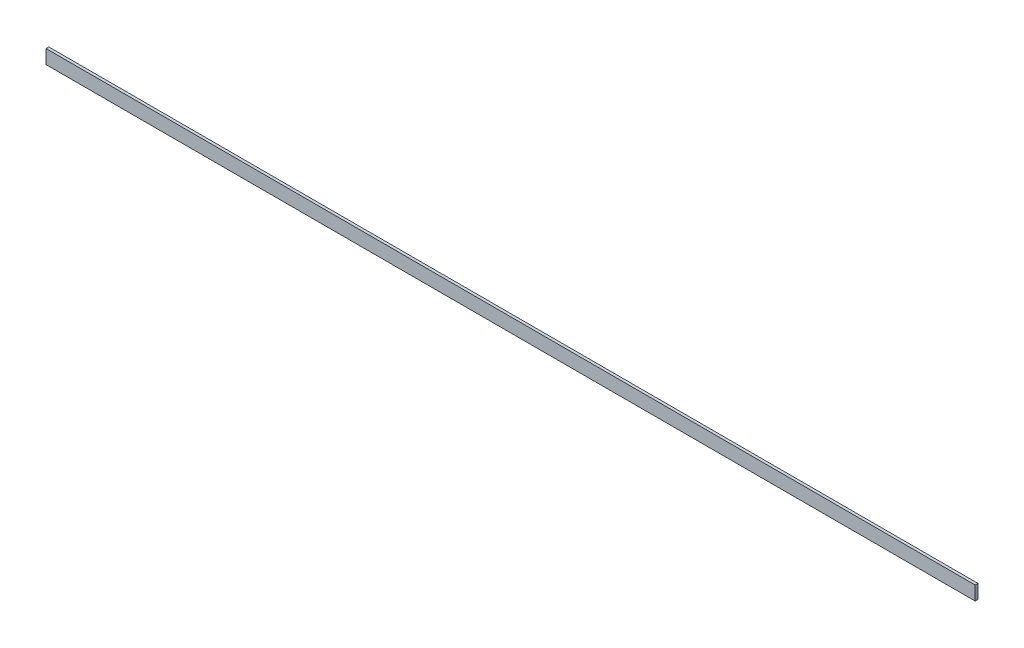
ISO-10303-21;
HEADER;
FILE_DESCRIPTION(('STEP AP214'),'2;1');
FILE_NAME('part.step','',(''),(''),'','','');
FILE_SCHEMA(('AUTOMOTIVE_DESIGN { 1 0 10303 214 1 1 1 1 }'));
ENDSEC;
DATA;
#1=APPLICATION_CONTEXT('core data for automotive mechanical design processes');
#2=APPLICATION_PROTOCOL_DEFINITION('international standard','automotive_design',2000,#1);
#3=PRODUCT_CONTEXT('',#1,'mechanical');
#4=PRODUCT('Part','Part','',(#3));
#5=PRODUCT_RELATED_PRODUCT_CATEGORY('part','',(#4));
#6=PRODUCT_DEFINITION_FORMATION('','',#4);
#7=PRODUCT_DEFINITION_CONTEXT('part definition',#1,'design');
#8=PRODUCT_DEFINITION('design','',#6,#7);
#9=PRODUCT_DEFINITION_SHAPE('','',#8);
#10=(LENGTH_UNIT() NAMED_UNIT(*) SI_UNIT(.MILLI.,.METRE.));
#11=(NAMED_UNIT(*) PLANE_ANGLE_UNIT() SI_UNIT($,.RADIAN.));
#12=(NAMED_UNIT(*) SI_UNIT($,.STERADIAN.) SOLID_ANGLE_UNIT());
#13=UNCERTAINTY_MEASURE_WITH_UNIT(LENGTH_MEASURE(1.E-05),#10,'distance_accuracy_value','');
#14=(GEOMETRIC_REPRESENTATION_CONTEXT(3) GLOBAL_UNCERTAINTY_ASSIGNED_CONTEXT((#13)) GLOBAL_UNIT_ASSIGNED_CONTEXT((#10,
#11,#12)) REPRESENTATION_CONTEXT('',''));
#15=CARTESIAN_POINT('',(0.,0.,0.));
#16=DIRECTION('',(0.,0.,1.));
#17=DIRECTION('',(1.,0.,0.));
#18=AXIS2_PLACEMENT_3D('',#15,#16,#17);
#19=CARTESIAN_POINT('',(1000.,15.0000000000001,3.));
#20=DIRECTION('',(1.,0.,0.));
#21=DIRECTION('',(0.,0.,-1.));
#22=AXIS2_PLACEMENT_3D('',#19,#20,#21);
#23=PLANE('',#22);
#24=DIRECTION('',(0.,-1.,0.));
#25=VECTOR('',#24,1.);
#26=CARTESIAN_POINT('',(1000.,15.0000000000001,0.));
#27=LINE('',#26,#25);
#28=CARTESIAN_POINT('',(1000.,15.0000000000001,0.));
#29=VERTEX_POINT('',#28);
#30=CARTESIAN_POINT('',(1000.,1.21430643318376E-13,0.));
#31=VERTEX_POINT('',#30);
#32=EDGE_CURVE('E114',#29,#31,#27,.T.);
#33=ORIENTED_EDGE('',*,*,#32,.F.);
#34=DIRECTION('',(0.,0.,-1.));
#35=VECTOR('',#34,1.);
#36=CARTESIAN_POINT('',(1000.,15.0000000000001,3.));
#37=LINE('',#36,#35);
#38=CARTESIAN_POINT('',(1000.,15.0000000000001,3.));
#39=VERTEX_POINT('',#38);
#40=EDGE_CURVE('E11',#39,#29,#37,.T.);
#41=ORIENTED_EDGE('',*,*,#40,.F.);
#42=DIRECTION('',(0.,-1.,0.));
#43=VECTOR('',#42,1.);
#44=CARTESIAN_POINT('',(1000.,15.0000000000001,3.));
#45=LINE('',#44,#43);
#46=CARTESIAN_POINT('',(1000.,1.21430643318376E-13,3.));
#47=VERTEX_POINT('',#46);
#48=EDGE_CURVE('E107',#39,#47,#45,.T.);
#49=ORIENTED_EDGE('',*,*,#48,.T.);
#50=DIRECTION('',(0.,0.,-1.));
#51=VECTOR('',#50,1.);
#52=CARTESIAN_POINT('',(1000.,1.21430643318376E-13,3.));
#53=LINE('',#52,#51);
#54=EDGE_CURVE('E46',#47,#31,#53,.T.);
#55=ORIENTED_EDGE('',*,*,#54,.T.);
#56=EDGE_LOOP('',(#33,#41,#49,#55));
#57=FACE_BOUND('',#56,.T.);
#58=ADVANCED_FACE('F43',(#57),#23,.T.);
#59=CARTESIAN_POINT('',(1000.,15.0000000000001,3.));
#60=DIRECTION('',(0.,-1.,0.));
#61=DIRECTION('',(1.,0.,0.));
#62=AXIS2_PLACEMENT_3D('',#59,#60,#61);
#63=PLANE('',#62);
#64=DIRECTION('',(-1.,0.,0.));
#65=VECTOR('',#64,1.);
#66=CARTESIAN_POINT('',(1000.,15.0000000000001,0.));
#67=LINE('',#66,#65);
#68=CARTESIAN_POINT('',(0.,15.,0.));
#69=VERTEX_POINT('',#68);
#70=EDGE_CURVE('E77',#29,#69,#67,.T.);
#71=ORIENTED_EDGE('',*,*,#70,.T.);
#72=DIRECTION('',(0.,0.,-1.));
#73=VECTOR('',#72,1.);
#74=CARTESIAN_POINT('',(0.,15.,3.));
#75=LINE('',#74,#73);
#76=CARTESIAN_POINT('',(0.,15.,3.));
#77=VERTEX_POINT('',#76);
#78=EDGE_CURVE('E53',#77,#69,#75,.T.);
#79=ORIENTED_EDGE('',*,*,#78,.F.);
#80=DIRECTION('',(-1.,0.,0.));
#81=VECTOR('',#80,1.);
#82=CARTESIAN_POINT('',(1000.,15.0000000000001,3.));
#83=LINE('',#82,#81);
#84=EDGE_CURVE('E92',#39,#77,#83,.T.);
#85=ORIENTED_EDGE('',*,*,#84,.F.);
#86=ORIENTED_EDGE('',*,*,#40,.T.);
#87=EDGE_LOOP('',(#71,#79,#85,#86));
#88=FACE_BOUND('',#87,.T.);
#89=ADVANCED_FACE('F130',(#88),#63,.F.);
#90=CARTESIAN_POINT('',(0.,15.,3.));
#91=DIRECTION('',(1.,0.,0.));
#92=DIRECTION('',(0.,1.,0.));
#93=AXIS2_PLACEMENT_3D('',#90,#91,#92);
#94=PLANE('',#93);
#95=DIRECTION('',(0.,-1.,0.));
#96=VECTOR('',#95,1.);
#97=CARTESIAN_POINT('',(0.,15.,0.));
#98=LINE('',#97,#96);
#99=CARTESIAN_POINT('',(0.,0.,0.));
#100=VERTEX_POINT('',#99);
#101=EDGE_CURVE('E100',#69,#100,#98,.T.);
#102=ORIENTED_EDGE('',*,*,#101,.T.);
#103=DIRECTION('',(0.,0.,-1.));
#104=VECTOR('',#103,1.);
#105=CARTESIAN_POINT('',(0.,0.,3.));
#106=LINE('',#105,#104);
#107=CARTESIAN_POINT('',(0.,0.,3.));
#108=VERTEX_POINT('',#107);
#109=EDGE_CURVE('E97',#108,#100,#106,.T.);
#110=ORIENTED_EDGE('',*,*,#109,.F.);
#111=DIRECTION('',(0.,-1.,0.));
#112=VECTOR('',#111,1.);
#113=CARTESIAN_POINT('',(0.,15.,3.));
#114=LINE('',#113,#112);
#115=EDGE_CURVE('E89',#77,#108,#114,.T.);
#116=ORIENTED_EDGE('',*,*,#115,.F.);
#117=ORIENTED_EDGE('',*,*,#78,.T.);
#118=EDGE_LOOP('',(#102,#110,#116,#117));
#119=FACE_BOUND('',#118,.T.);
#120=ADVANCED_FACE('F98',(#119),#94,.F.);
#121=CARTESIAN_POINT('',(0.,0.,3.));
#122=DIRECTION('',(0.,1.,0.));
#123=DIRECTION('',(-1.,0.,0.));
#124=AXIS2_PLACEMENT_3D('',#121,#122,#123);
#125=PLANE('',#124);
#126=DIRECTION('',(1.,0.,0.));
#127=VECTOR('',#126,1.);
#128=CARTESIAN_POINT('',(0.,0.,0.));
#129=LINE('',#128,#127);
#130=EDGE_CURVE('E118',#100,#31,#129,.T.);
#131=ORIENTED_EDGE('',*,*,#130,.T.);
#132=ORIENTED_EDGE('',*,*,#54,.F.);
#133=DIRECTION('',(1.,0.,0.));
#134=VECTOR('',#133,1.);
#135=CARTESIAN_POINT('',(0.,0.,3.));
#136=LINE('',#135,#134);
#137=EDGE_CURVE('E86',#108,#47,#136,.T.);
#138=ORIENTED_EDGE('',*,*,#137,.F.);
#139=ORIENTED_EDGE('',*,*,#109,.T.);
#140=EDGE_LOOP('',(#131,#132,#138,#139));
#141=FACE_BOUND('',#140,.T.);
#142=ADVANCED_FACE('F105',(#141),#125,.F.);
#143=CARTESIAN_POINT('',(0.,0.,3.));
#144=DIRECTION('',(0.,0.,1.));
#145=DIRECTION('',(1.,0.,0.));
#146=AXIS2_PLACEMENT_3D('',#143,#144,#145);
#147=PLANE('',#146);
#148=ORIENTED_EDGE('',*,*,#48,.F.);
#149=ORIENTED_EDGE('',*,*,#84,.T.);
#150=ORIENTED_EDGE('',*,*,#115,.T.);
#151=ORIENTED_EDGE('',*,*,#137,.T.);
#152=EDGE_LOOP('',(#148,#149,#150,#151));
#153=FACE_BOUND('',#152,.T.);
#154=ADVANCED_FACE('F91',(#153),#147,.T.);
#155=CARTESIAN_POINT('',(0.,0.,0.));
#156=DIRECTION('',(0.,0.,1.));
#157=DIRECTION('',(1.,0.,0.));
#158=AXIS2_PLACEMENT_3D('',#155,#156,#157);
#159=PLANE('',#158);
#160=ORIENTED_EDGE('',*,*,#32,.T.);
#161=ORIENTED_EDGE('',*,*,#130,.F.);
#162=ORIENTED_EDGE('',*,*,#101,.F.);
#163=ORIENTED_EDGE('',*,*,#70,.F.);
#164=EDGE_LOOP('',(#160,#161,#162,#163));
#165=FACE_BOUND('',#164,.T.);
#166=ADVANCED_FACE('F127',(#165),#159,.F.);
#167=CLOSED_SHELL('',(#58,#89,#120,#142,#154,#166));
#168=MANIFOLD_SOLID_BREP('B2',#167);
#169=ADVANCED_BREP_SHAPE_REPRESENTATION('',(#18,#168),#14);
#170=SHAPE_DEFINITION_REPRESENTATION(#9,#169);
ENDSEC;
END-ISO-10303-21;
